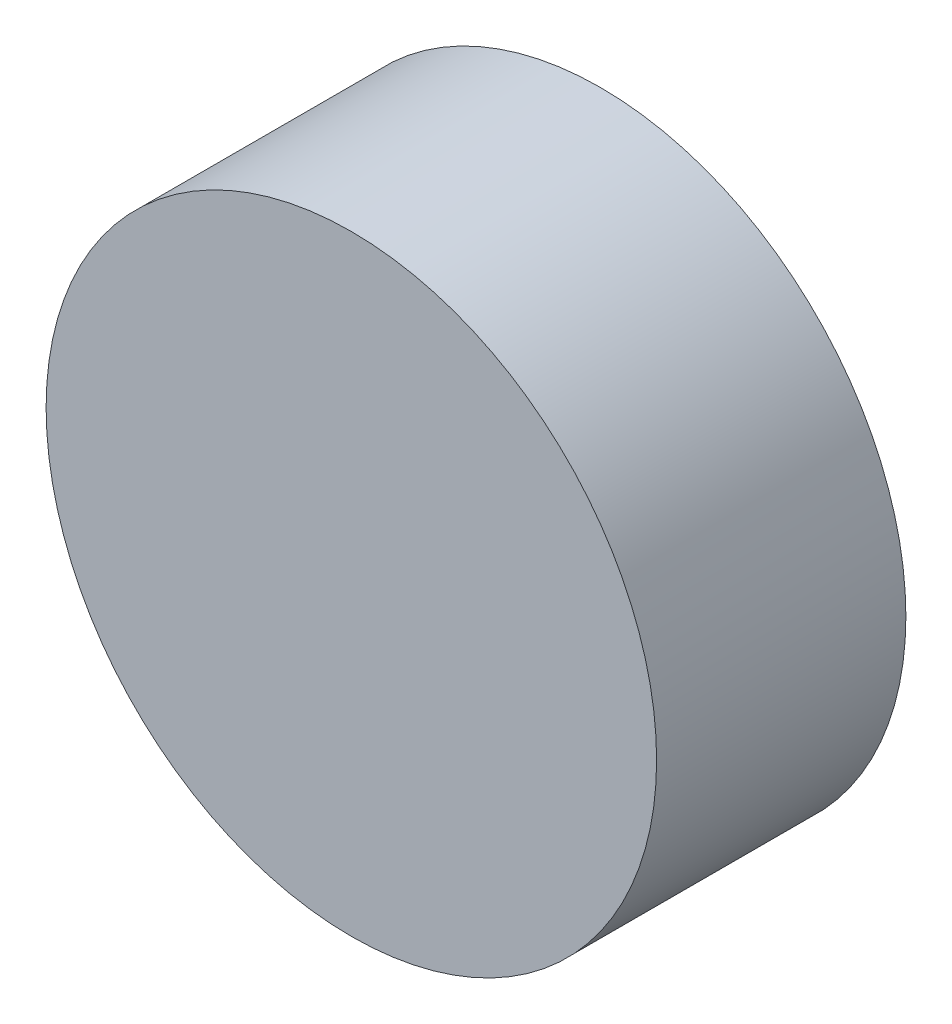
ISO-10303-21;
HEADER;
FILE_DESCRIPTION(('STEP AP214'),'2;1');
FILE_NAME('part.step','',(''),(''),'','','');
FILE_SCHEMA(('AUTOMOTIVE_DESIGN { 1 0 10303 214 1 1 1 1 }'));
ENDSEC;
DATA;
#1=APPLICATION_CONTEXT('core data for automotive mechanical design processes');
#2=APPLICATION_PROTOCOL_DEFINITION('international standard','automotive_design',2000,#1);
#3=PRODUCT_CONTEXT('',#1,'mechanical');
#4=PRODUCT('Part','Part','',(#3));
#5=PRODUCT_RELATED_PRODUCT_CATEGORY('part','',(#4));
#6=PRODUCT_DEFINITION_FORMATION('','',#4);
#7=PRODUCT_DEFINITION_CONTEXT('part definition',#1,'design');
#8=PRODUCT_DEFINITION('design','',#6,#7);
#9=PRODUCT_DEFINITION_SHAPE('','',#8);
#10=(LENGTH_UNIT() NAMED_UNIT(*) SI_UNIT(.MILLI.,.METRE.));
#11=(NAMED_UNIT(*) PLANE_ANGLE_UNIT() SI_UNIT($,.RADIAN.));
#12=(NAMED_UNIT(*) SI_UNIT($,.STERADIAN.) SOLID_ANGLE_UNIT());
#13=UNCERTAINTY_MEASURE_WITH_UNIT(LENGTH_MEASURE(1.E-05),#10,'distance_accuracy_value','');
#14=(GEOMETRIC_REPRESENTATION_CONTEXT(3) GLOBAL_UNCERTAINTY_ASSIGNED_CONTEXT((#13)) GLOBAL_UNIT_ASSIGNED_CONTEXT((#10,
#11,#12)) REPRESENTATION_CONTEXT('',''));
#15=CARTESIAN_POINT('',(0.,0.,0.));
#16=DIRECTION('',(0.,0.,1.));
#17=DIRECTION('',(1.,0.,0.));
#18=AXIS2_PLACEMENT_3D('',#15,#16,#17);
#19=CARTESIAN_POINT('',(0.,0.,6.9));
#20=DIRECTION('',(0.,0.,1.));
#21=DIRECTION('',(1.,0.,0.));
#22=AXIS2_PLACEMENT_3D('',#19,#20,#21);
#23=PLANE('',#22);
#24=CARTESIAN_POINT('',(0.,0.,6.9));
#25=DIRECTION('',(0.,0.,-1.));
#26=DIRECTION('',(-1.,0.,0.));
#27=AXIS2_PLACEMENT_3D('',#24,#25,#26);
#28=CIRCLE('',#27,16.9);
#29=CARTESIAN_POINT('',(-16.9,0.,6.9));
#30=VERTEX_POINT('',#29);
#31=EDGE_CURVE('E9',#30,#30,#28,.T.);
#32=ORIENTED_EDGE('',*,*,#31,.F.);
#33=EDGE_LOOP('',(#32));
#34=FACE_BOUND('',#33,.T.);
#35=ADVANCED_FACE('F14',(#34),#23,.T.);
#36=CARTESIAN_POINT('',(0.,0.,-6.9));
#37=DIRECTION('',(0.,0.,-1.));
#38=DIRECTION('',(-1.,0.,0.));
#39=AXIS2_PLACEMENT_3D('',#36,#37,#38);
#40=PLANE('',#39);
#41=CARTESIAN_POINT('',(0.,0.,-6.9));
#42=DIRECTION('',(0.,0.,1.));
#43=DIRECTION('',(1.,0.,0.));
#44=AXIS2_PLACEMENT_3D('',#41,#42,#43);
#45=CIRCLE('',#44,16.9);
#46=CARTESIAN_POINT('',(16.9,0.,-6.9));
#47=VERTEX_POINT('',#46);
#48=EDGE_CURVE('E21',#47,#47,#45,.T.);
#49=ORIENTED_EDGE('',*,*,#48,.F.);
#50=EDGE_LOOP('',(#49));
#51=FACE_BOUND('',#50,.T.);
#52=ADVANCED_FACE('F29',(#51),#40,.T.);
#53=CARTESIAN_POINT('',(0.,0.,-6.9));
#54=DIRECTION('',(0.,0.,1.));
#55=DIRECTION('',(1.,0.,0.));
#56=AXIS2_PLACEMENT_3D('',#53,#54,#55);
#57=CYLINDRICAL_SURFACE('',#56,16.9);
#58=ORIENTED_EDGE('',*,*,#31,.T.);
#59=EDGE_LOOP('',(#58));
#60=FACE_BOUND('',#59,.T.);
#61=ORIENTED_EDGE('',*,*,#48,.T.);
#62=EDGE_LOOP('',(#61));
#63=FACE_BOUND('',#62,.T.);
#64=ADVANCED_FACE('F16',(#60,#63),#57,.T.);
#65=CLOSED_SHELL('',(#35,#52,#64));
#66=MANIFOLD_SOLID_BREP('B1',#65);
#67=ADVANCED_BREP_SHAPE_REPRESENTATION('',(#18,#66),#14);
#68=SHAPE_DEFINITION_REPRESENTATION(#9,#67);
ENDSEC;
END-ISO-10303-21;
